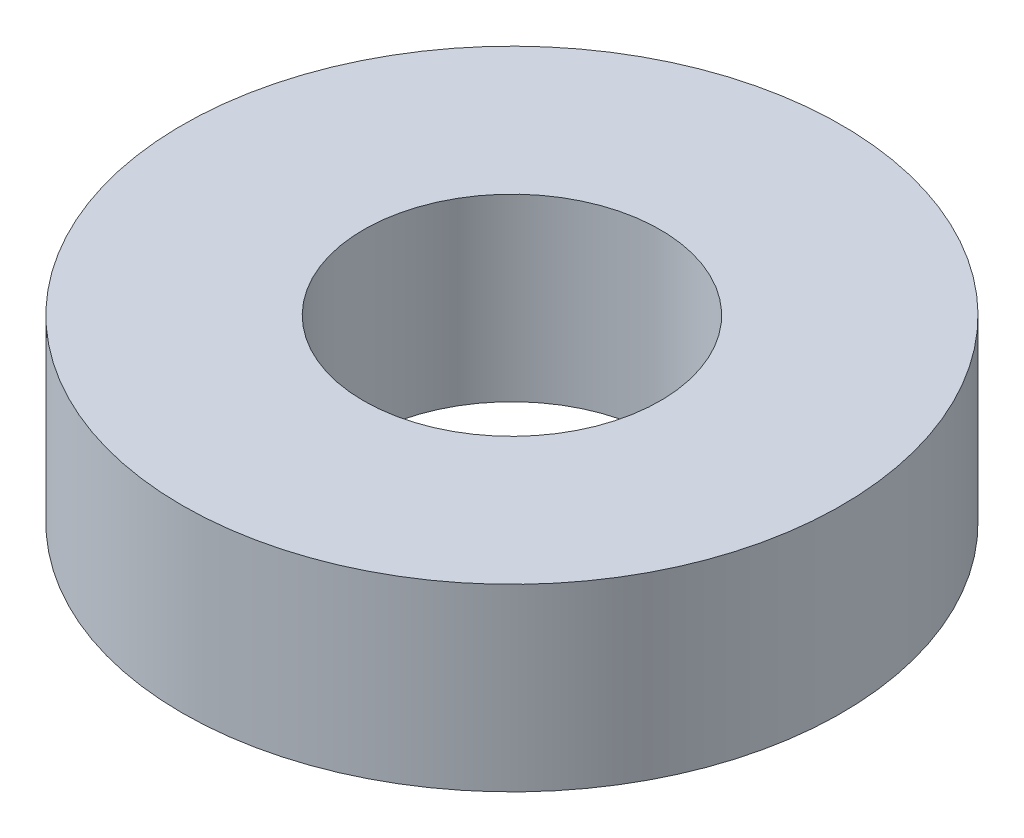
ISO-10303-21;
HEADER;
FILE_DESCRIPTION(('STEP AP214'),'2;1');
FILE_NAME('part.step','',(''),(''),'','','');
FILE_SCHEMA(('AUTOMOTIVE_DESIGN { 1 0 10303 214 1 1 1 1 }'));
ENDSEC;
DATA;
#1=APPLICATION_CONTEXT('core data for automotive mechanical design processes');
#2=APPLICATION_PROTOCOL_DEFINITION('international standard','automotive_design',2000,#1);
#3=PRODUCT_CONTEXT('',#1,'mechanical');
#4=PRODUCT('Part','Part','',(#3));
#5=PRODUCT_RELATED_PRODUCT_CATEGORY('part','',(#4));
#6=PRODUCT_DEFINITION_FORMATION('','',#4);
#7=PRODUCT_DEFINITION_CONTEXT('part definition',#1,'design');
#8=PRODUCT_DEFINITION('design','',#6,#7);
#9=PRODUCT_DEFINITION_SHAPE('','',#8);
#10=(LENGTH_UNIT() NAMED_UNIT(*) SI_UNIT(.MILLI.,.METRE.));
#11=(NAMED_UNIT(*) PLANE_ANGLE_UNIT() SI_UNIT($,.RADIAN.));
#12=(NAMED_UNIT(*) SI_UNIT($,.STERADIAN.) SOLID_ANGLE_UNIT());
#13=UNCERTAINTY_MEASURE_WITH_UNIT(LENGTH_MEASURE(1.E-05),#10,'distance_accuracy_value','');
#14=(GEOMETRIC_REPRESENTATION_CONTEXT(3) GLOBAL_UNCERTAINTY_ASSIGNED_CONTEXT((#13)) GLOBAL_UNIT_ASSIGNED_CONTEXT((#10,
#11,#12)) REPRESENTATION_CONTEXT('',''));
#15=CARTESIAN_POINT('',(0.,0.,0.));
#16=DIRECTION('',(0.,0.,1.));
#17=DIRECTION('',(1.,0.,0.));
#18=AXIS2_PLACEMENT_3D('',#15,#16,#17);
#19=CARTESIAN_POINT('',(0.,6.,0.));
#20=DIRECTION('',(0.,1.,0.));
#21=DIRECTION('',(0.,0.,1.));
#22=AXIS2_PLACEMENT_3D('',#19,#20,#21);
#23=PLANE('',#22);
#24=CARTESIAN_POINT('',(0.,6.,0.));
#25=DIRECTION('',(0.,1.,0.));
#26=DIRECTION('',(0.,0.,1.));
#27=AXIS2_PLACEMENT_3D('',#24,#25,#26);
#28=CIRCLE('',#27,11.);
#29=CARTESIAN_POINT('',(0.,6.,11.));
#30=VERTEX_POINT('',#29);
#31=EDGE_CURVE('E10',#30,#30,#28,.T.);
#32=ORIENTED_EDGE('',*,*,#31,.T.);
#33=EDGE_LOOP('',(#32));
#34=FACE_BOUND('',#33,.T.);
#35=CARTESIAN_POINT('',(0.,6.,0.));
#36=DIRECTION('',(0.,1.,0.));
#37=DIRECTION('',(0.,0.,1.));
#38=AXIS2_PLACEMENT_3D('',#35,#36,#37);
#39=CIRCLE('',#38,4.95);
#40=CARTESIAN_POINT('',(0.,6.,4.95));
#41=VERTEX_POINT('',#40);
#42=EDGE_CURVE('E50',#41,#41,#39,.T.);
#43=ORIENTED_EDGE('',*,*,#42,.F.);
#44=EDGE_LOOP('',(#43));
#45=FACE_BOUND('',#44,.T.);
#46=ADVANCED_FACE('F37',(#34,#45),#23,.T.);
#47=CARTESIAN_POINT('',(0.,0.,0.));
#48=DIRECTION('',(0.,1.,0.));
#49=DIRECTION('',(0.,0.,1.));
#50=AXIS2_PLACEMENT_3D('',#47,#48,#49);
#51=PLANE('',#50);
#52=CARTESIAN_POINT('',(0.,0.,0.));
#53=DIRECTION('',(0.,1.,0.));
#54=DIRECTION('',(0.,0.,1.));
#55=AXIS2_PLACEMENT_3D('',#52,#53,#54);
#56=CIRCLE('',#55,11.);
#57=CARTESIAN_POINT('',(0.,0.,11.));
#58=VERTEX_POINT('',#57);
#59=EDGE_CURVE('E41',#58,#58,#56,.T.);
#60=ORIENTED_EDGE('',*,*,#59,.F.);
#61=EDGE_LOOP('',(#60));
#62=FACE_BOUND('',#61,.T.);
#63=CARTESIAN_POINT('',(0.,0.,0.));
#64=DIRECTION('',(0.,1.,0.));
#65=DIRECTION('',(0.,0.,1.));
#66=AXIS2_PLACEMENT_3D('',#63,#64,#65);
#67=CIRCLE('',#66,4.95);
#68=CARTESIAN_POINT('',(0.,0.,4.95));
#69=VERTEX_POINT('',#68);
#70=EDGE_CURVE('E52',#69,#69,#67,.T.);
#71=ORIENTED_EDGE('',*,*,#70,.T.);
#72=EDGE_LOOP('',(#71));
#73=FACE_BOUND('',#72,.T.);
#74=ADVANCED_FACE('F64',(#62,#73),#51,.F.);
#75=CARTESIAN_POINT('',(0.,6.,0.));
#76=DIRECTION('',(0.,-1.,0.));
#77=DIRECTION('',(0.,0.,-1.));
#78=AXIS2_PLACEMENT_3D('',#75,#76,#77);
#79=CYLINDRICAL_SURFACE('',#78,11.);
#80=ORIENTED_EDGE('',*,*,#31,.F.);
#81=EDGE_LOOP('',(#80));
#82=FACE_BOUND('',#81,.T.);
#83=ORIENTED_EDGE('',*,*,#59,.T.);
#84=EDGE_LOOP('',(#83));
#85=FACE_BOUND('',#84,.T.);
#86=ADVANCED_FACE('F39',(#82,#85),#79,.T.);
#87=CARTESIAN_POINT('',(0.,6.,0.));
#88=DIRECTION('',(0.,-1.,0.));
#89=DIRECTION('',(0.,0.,-1.));
#90=AXIS2_PLACEMENT_3D('',#87,#88,#89);
#91=CYLINDRICAL_SURFACE('',#90,4.95);
#92=ORIENTED_EDGE('',*,*,#42,.T.);
#93=EDGE_LOOP('',(#92));
#94=FACE_BOUND('',#93,.T.);
#95=ORIENTED_EDGE('',*,*,#70,.F.);
#96=EDGE_LOOP('',(#95));
#97=FACE_BOUND('',#96,.T.);
#98=ADVANCED_FACE('F60',(#94,#97),#91,.F.);
#99=CLOSED_SHELL('',(#46,#74,#86,#98));
#100=MANIFOLD_SOLID_BREP('B2',#99);
#101=ADVANCED_BREP_SHAPE_REPRESENTATION('',(#18,#100),#14);
#102=SHAPE_DEFINITION_REPRESENTATION(#9,#101);
ENDSEC;
END-ISO-10303-21;
